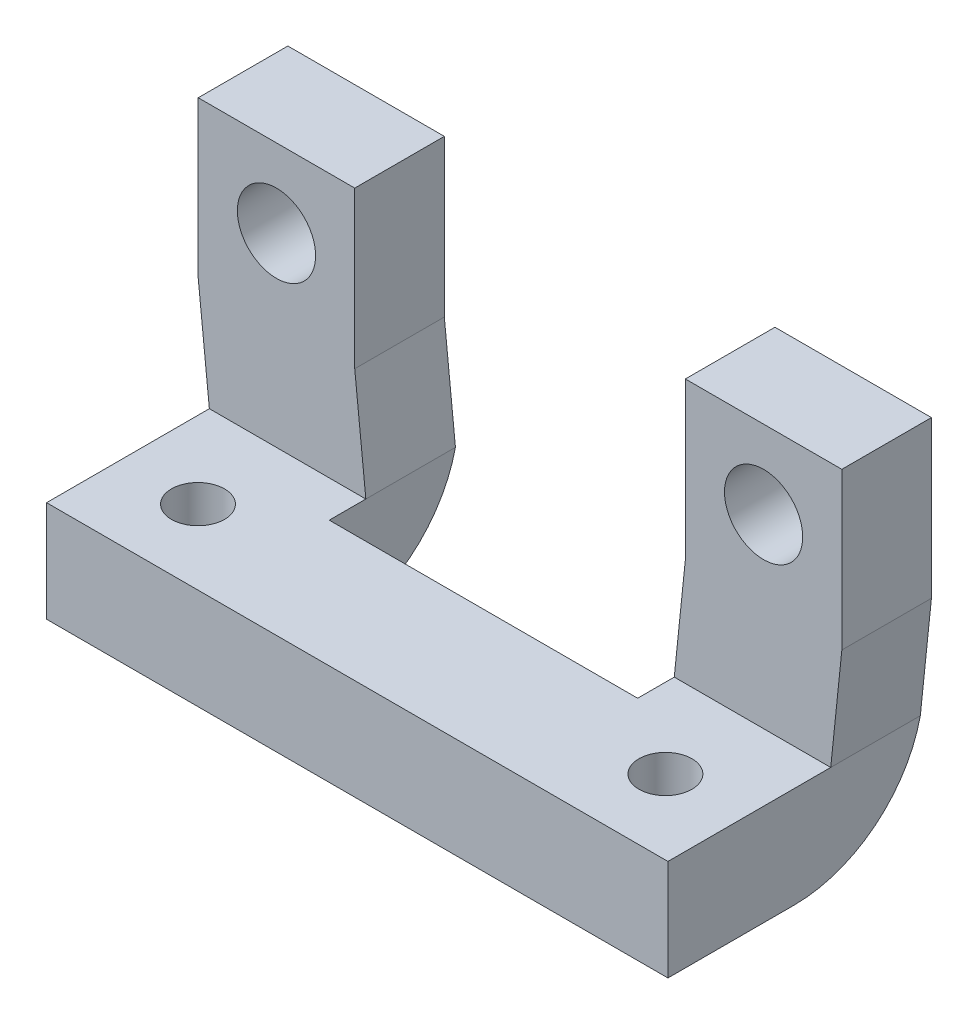
ISO-10303-21;
HEADER;
FILE_DESCRIPTION(('STEP AP214'),'2;1');
FILE_NAME('part.step','',(''),(''),'','','');
FILE_SCHEMA(('AUTOMOTIVE_DESIGN { 1 0 10303 214 1 1 1 1 }'));
ENDSEC;
DATA;
#1=APPLICATION_CONTEXT('core data for automotive mechanical design processes');
#2=APPLICATION_PROTOCOL_DEFINITION('international standard','automotive_design',2000,#1);
#3=PRODUCT_CONTEXT('',#1,'mechanical');
#4=PRODUCT('Part','Part','',(#3));
#5=PRODUCT_RELATED_PRODUCT_CATEGORY('part','',(#4));
#6=PRODUCT_DEFINITION_FORMATION('','',#4);
#7=PRODUCT_DEFINITION_CONTEXT('part definition',#1,'design');
#8=PRODUCT_DEFINITION('design','',#6,#7);
#9=PRODUCT_DEFINITION_SHAPE('','',#8);
#10=(LENGTH_UNIT() NAMED_UNIT(*) SI_UNIT(.MILLI.,.METRE.));
#11=(NAMED_UNIT(*) PLANE_ANGLE_UNIT() SI_UNIT($,.RADIAN.));
#12=(NAMED_UNIT(*) SI_UNIT($,.STERADIAN.) SOLID_ANGLE_UNIT());
#13=UNCERTAINTY_MEASURE_WITH_UNIT(LENGTH_MEASURE(1.E-05),#10,'distance_accuracy_value','');
#14=(GEOMETRIC_REPRESENTATION_CONTEXT(3) GLOBAL_UNCERTAINTY_ASSIGNED_CONTEXT((#13)) GLOBAL_UNIT_ASSIGNED_CONTEXT((#10,
#11,#12)) REPRESENTATION_CONTEXT('',''));
#15=CARTESIAN_POINT('',(0.,0.,0.));
#16=DIRECTION('',(0.,0.,1.));
#17=DIRECTION('',(1.,0.,0.));
#18=AXIS2_PLACEMENT_3D('',#15,#16,#17);
#19=CARTESIAN_POINT('',(0.,0.,-10.));
#20=DIRECTION('',(0.,0.,1.));
#21=DIRECTION('',(1.,0.,0.));
#22=AXIS2_PLACEMENT_3D('',#19,#20,#21);
#23=PLANE('',#22);
#24=DIRECTION('',(-1.,0.,0.));
#25=VECTOR('',#24,1.);
#26=CARTESIAN_POINT('',(-6.11,4.,-10.));
#27=LINE('',#26,#25);
#28=CARTESIAN_POINT('',(-6.11,4.,-10.));
#29=VERTEX_POINT('',#28);
#30=CARTESIAN_POINT('',(-12.31,4.,-10.));
#31=VERTEX_POINT('',#30);
#32=EDGE_CURVE('E293',#29,#31,#27,.T.);
#33=ORIENTED_EDGE('',*,*,#32,.T.);
#34=DIRECTION('',(-0.102979000781295,0.994683530273868,0.));
#35=VECTOR('',#34,1.);
#36=CARTESIAN_POINT('',(-12.75,8.25,-10.));
#37=LINE('',#36,#35);
#38=CARTESIAN_POINT('',(-12.75,8.25,-10.));
#39=VERTEX_POINT('',#38);
#40=EDGE_CURVE('E296',#31,#39,#37,.T.);
#41=ORIENTED_EDGE('',*,*,#40,.T.);
#42=DIRECTION('',(0.,1.,0.));
#43=VECTOR('',#42,1.);
#44=CARTESIAN_POINT('',(-12.75,14.45,-10.));
#45=LINE('',#44,#43);
#46=CARTESIAN_POINT('',(-12.75,14.45,-10.));
#47=VERTEX_POINT('',#46);
#48=EDGE_CURVE('E299',#39,#47,#45,.T.);
#49=ORIENTED_EDGE('',*,*,#48,.T.);
#50=DIRECTION('',(1.,0.,0.));
#51=VECTOR('',#50,1.);
#52=CARTESIAN_POINT('',(-6.55,14.45,-10.));
#53=LINE('',#52,#51);
#54=CARTESIAN_POINT('',(-6.55,14.45,-10.));
#55=VERTEX_POINT('',#54);
#56=EDGE_CURVE('E302',#47,#55,#53,.T.);
#57=ORIENTED_EDGE('',*,*,#56,.T.);
#58=DIRECTION('',(0.,-1.,0.));
#59=VECTOR('',#58,1.);
#60=CARTESIAN_POINT('',(-6.55,8.25,-10.));
#61=LINE('',#60,#59);
#62=CARTESIAN_POINT('',(-6.55,8.25,-10.));
#63=VERTEX_POINT('',#62);
#64=EDGE_CURVE('E61',#55,#63,#61,.T.);
#65=ORIENTED_EDGE('',*,*,#64,.T.);
#66=DIRECTION('',(0.102979000781295,-0.994683530273868,0.));
#67=VECTOR('',#66,1.);
#68=CARTESIAN_POINT('',(-6.11,4.,-10.));
#69=LINE('',#68,#67);
#70=EDGE_CURVE('E56',#63,#29,#69,.T.);
#71=ORIENTED_EDGE('',*,*,#70,.T.);
#72=EDGE_LOOP('',(#33,#41,#49,#57,#65,#71));
#73=FACE_BOUND('',#72,.T.);
#74=CARTESIAN_POINT('',(-9.65,11.35,-10.));
#75=DIRECTION('',(0.,0.,-1.));
#76=DIRECTION('',(-1.,0.,0.));
#77=AXIS2_PLACEMENT_3D('',#74,#75,#76);
#78=CIRCLE('',#77,1.55);
#79=CARTESIAN_POINT('',(-11.2,11.35,-10.));
#80=VERTEX_POINT('',#79);
#81=EDGE_CURVE('E289',#80,#80,#78,.T.);
#82=ORIENTED_EDGE('',*,*,#81,.F.);
#83=EDGE_LOOP('',(#82));
#84=FACE_BOUND('',#83,.T.);
#85=ADVANCED_FACE('F39',(#73,#84),#23,.F.);
#86=CARTESIAN_POINT('',(-12.75,8.25,-10.));
#87=DIRECTION('',(0.994683530273869,0.102979000781295,0.));
#88=DIRECTION('',(-0.102979000781295,0.994683530273869,0.));
#89=AXIS2_PLACEMENT_3D('',#86,#87,#88);
#90=PLANE('',#89);
#91=DIRECTION('',(0.,0.,1.));
#92=VECTOR('',#91,1.);
#93=CARTESIAN_POINT('',(-12.31,4.,-10.));
#94=LINE('',#93,#92);
#95=CARTESIAN_POINT('',(-12.31,4.,-6.44999999999999));
#96=VERTEX_POINT('',#95);
#97=EDGE_CURVE('E11',#31,#96,#94,.T.);
#98=ORIENTED_EDGE('',*,*,#97,.T.);
#99=DIRECTION('',(-0.102979000781295,0.994683530273869,0.));
#100=VECTOR('',#99,1.);
#101=CARTESIAN_POINT('',(-12.75,8.25,-6.44999999999999));
#102=LINE('',#101,#100);
#103=CARTESIAN_POINT('',(-12.75,8.25,-6.44999999999999));
#104=VERTEX_POINT('',#103);
#105=EDGE_CURVE('E337',#96,#104,#102,.T.);
#106=ORIENTED_EDGE('',*,*,#105,.T.);
#107=DIRECTION('',(0.,0.,1.));
#108=VECTOR('',#107,1.);
#109=CARTESIAN_POINT('',(-12.75,8.25,-10.));
#110=LINE('',#109,#108);
#111=EDGE_CURVE('E49',#39,#104,#110,.T.);
#112=ORIENTED_EDGE('',*,*,#111,.F.);
#113=ORIENTED_EDGE('',*,*,#40,.F.);
#114=EDGE_LOOP('',(#98,#106,#112,#113));
#115=FACE_BOUND('',#114,.T.);
#116=ADVANCED_FACE('F41',(#115),#90,.F.);
#117=CARTESIAN_POINT('',(-12.75,14.45,-10.));
#118=DIRECTION('',(1.,0.,0.));
#119=DIRECTION('',(0.,0.,-1.));
#120=AXIS2_PLACEMENT_3D('',#117,#118,#119);
#121=PLANE('',#120);
#122=ORIENTED_EDGE('',*,*,#111,.T.);
#123=DIRECTION('',(0.,-1.,0.));
#124=VECTOR('',#123,1.);
#125=CARTESIAN_POINT('',(-12.75,4.,-6.44999999999999));
#126=LINE('',#125,#124);
#127=CARTESIAN_POINT('',(-12.75,14.45,-6.45));
#128=VERTEX_POINT('',#127);
#129=EDGE_CURVE('E333',#128,#104,#126,.T.);
#130=ORIENTED_EDGE('',*,*,#129,.F.);
#131=DIRECTION('',(0.,0.,1.));
#132=VECTOR('',#131,1.);
#133=CARTESIAN_POINT('',(-12.75,14.45,-10.));
#134=LINE('',#133,#132);
#135=EDGE_CURVE('E321',#47,#128,#134,.T.);
#136=ORIENTED_EDGE('',*,*,#135,.F.);
#137=ORIENTED_EDGE('',*,*,#48,.F.);
#138=EDGE_LOOP('',(#122,#130,#136,#137));
#139=FACE_BOUND('',#138,.T.);
#140=ADVANCED_FACE('F331',(#139),#121,.F.);
#141=CARTESIAN_POINT('',(-6.55,14.45,-10.));
#142=DIRECTION('',(0.,-1.,0.));
#143=DIRECTION('',(0.,0.,-1.));
#144=AXIS2_PLACEMENT_3D('',#141,#142,#143);
#145=PLANE('',#144);
#146=ORIENTED_EDGE('',*,*,#135,.T.);
#147=DIRECTION('',(1.,0.,0.));
#148=VECTOR('',#147,1.);
#149=CARTESIAN_POINT('',(-23.300118482747,14.45,-6.44999999999999));
#150=LINE('',#149,#148);
#151=CARTESIAN_POINT('',(-6.55,14.45,-6.44999999999999));
#152=VERTEX_POINT('',#151);
#153=EDGE_CURVE('E183',#128,#152,#150,.T.);
#154=ORIENTED_EDGE('',*,*,#153,.T.);
#155=DIRECTION('',(0.,0.,1.));
#156=VECTOR('',#155,1.);
#157=CARTESIAN_POINT('',(-6.55,14.45,-10.));
#158=LINE('',#157,#156);
#159=EDGE_CURVE('E317',#55,#152,#158,.T.);
#160=ORIENTED_EDGE('',*,*,#159,.F.);
#161=ORIENTED_EDGE('',*,*,#56,.F.);
#162=EDGE_LOOP('',(#146,#154,#160,#161));
#163=FACE_BOUND('',#162,.T.);
#164=ADVANCED_FACE('F430',(#163),#145,.F.);
#165=CARTESIAN_POINT('',(-6.55,8.25,-10.));
#166=DIRECTION('',(-1.,0.,0.));
#167=DIRECTION('',(0.,0.,1.));
#168=AXIS2_PLACEMENT_3D('',#165,#166,#167);
#169=PLANE('',#168);
#170=ORIENTED_EDGE('',*,*,#159,.T.);
#171=DIRECTION('',(0.,-1.,0.));
#172=VECTOR('',#171,1.);
#173=CARTESIAN_POINT('',(-6.55,8.25,-6.44999999999999));
#174=LINE('',#173,#172);
#175=CARTESIAN_POINT('',(-6.55,8.25,-6.44999999999999));
#176=VERTEX_POINT('',#175);
#177=EDGE_CURVE('E344',#152,#176,#174,.T.);
#178=ORIENTED_EDGE('',*,*,#177,.T.);
#179=DIRECTION('',(0.,0.,1.));
#180=VECTOR('',#179,1.);
#181=CARTESIAN_POINT('',(-6.55,8.25,-10.));
#182=LINE('',#181,#180);
#183=EDGE_CURVE('E313',#63,#176,#182,.T.);
#184=ORIENTED_EDGE('',*,*,#183,.F.);
#185=ORIENTED_EDGE('',*,*,#64,.F.);
#186=EDGE_LOOP('',(#170,#178,#184,#185));
#187=FACE_BOUND('',#186,.T.);
#188=ADVANCED_FACE('F432',(#187),#169,.F.);
#189=CARTESIAN_POINT('',(-6.11,4.,-10.));
#190=DIRECTION('',(-0.994683530273869,-0.102979000781295,0.));
#191=DIRECTION('',(0.102979000781295,-0.994683530273869,0.));
#192=AXIS2_PLACEMENT_3D('',#189,#190,#191);
#193=PLANE('',#192);
#194=ORIENTED_EDGE('',*,*,#183,.T.);
#195=DIRECTION('',(0.102979000781295,-0.994683530273869,0.));
#196=VECTOR('',#195,1.);
#197=CARTESIAN_POINT('',(-6.11,4.,-6.44999999999999));
#198=LINE('',#197,#196);
#199=CARTESIAN_POINT('',(-6.11,4.,-6.44999999999999));
#200=VERTEX_POINT('',#199);
#201=EDGE_CURVE('E352',#176,#200,#198,.T.);
#202=ORIENTED_EDGE('',*,*,#201,.T.);
#203=DIRECTION('',(0.,0.,1.));
#204=VECTOR('',#203,1.);
#205=CARTESIAN_POINT('',(-6.11,4.,-10.));
#206=LINE('',#205,#204);
#207=EDGE_CURVE('E309',#29,#200,#206,.T.);
#208=ORIENTED_EDGE('',*,*,#207,.F.);
#209=ORIENTED_EDGE('',*,*,#70,.F.);
#210=EDGE_LOOP('',(#194,#202,#208,#209));
#211=FACE_BOUND('',#210,.T.);
#212=ADVANCED_FACE('F416',(#211),#193,.F.);
#213=CARTESIAN_POINT('',(-9.65,11.35,-10.));
#214=DIRECTION('',(0.,0.,1.));
#215=DIRECTION('',(1.,0.,0.));
#216=AXIS2_PLACEMENT_3D('',#213,#214,#215);
#217=CYLINDRICAL_SURFACE('',#216,1.55);
#218=CARTESIAN_POINT('',(-9.65,11.35,-6.44999999999999));
#219=DIRECTION('',(0.,0.,-1.));
#220=DIRECTION('',(-1.,0.,0.));
#221=AXIS2_PLACEMENT_3D('',#218,#219,#220);
#222=CIRCLE('',#221,1.55);
#223=CARTESIAN_POINT('',(-11.2,11.35,-6.44999999999999));
#224=VERTEX_POINT('',#223);
#225=EDGE_CURVE('E407',#224,#224,#222,.T.);
#226=ORIENTED_EDGE('',*,*,#225,.F.);
#227=EDGE_LOOP('',(#226));
#228=FACE_BOUND('',#227,.T.);
#229=ORIENTED_EDGE('',*,*,#81,.T.);
#230=EDGE_LOOP('',(#229));
#231=FACE_BOUND('',#230,.T.);
#232=ADVANCED_FACE('F483',(#228,#231),#217,.F.);
#233=CARTESIAN_POINT('',(-6.11,5.125,-5.));
#234=DIRECTION('',(-1.,0.,0.));
#235=DIRECTION('',(0.,0.,1.));
#236=AXIS2_PLACEMENT_3D('',#233,#234,#235);
#237=CYLINDRICAL_SURFACE('',#236,5.125);
#238=CARTESIAN_POINT('',(-12.31,5.125,-5.));
#239=DIRECTION('',(-1.,0.,0.));
#240=DIRECTION('',(0.,0.,1.));
#241=AXIS2_PLACEMENT_3D('',#238,#239,#240);
#242=CIRCLE('',#241,5.125);
#243=CARTESIAN_POINT('',(-12.31,0.,-5.));
#244=VERTEX_POINT('',#243);
#245=EDGE_CURVE('E273',#31,#244,#242,.T.);
#246=ORIENTED_EDGE('',*,*,#245,.F.);
#247=ORIENTED_EDGE('',*,*,#32,.F.);
#248=CARTESIAN_POINT('',(-6.11,5.125,-5.));
#249=DIRECTION('',(-1.,0.,0.));
#250=DIRECTION('',(0.,0.,1.));
#251=AXIS2_PLACEMENT_3D('',#248,#249,#250);
#252=CIRCLE('',#251,5.125);
#253=CARTESIAN_POINT('',(-6.10999999999999,0.,-5.));
#254=VERTEX_POINT('',#253);
#255=EDGE_CURVE('E274',#29,#254,#252,.T.);
#256=ORIENTED_EDGE('',*,*,#255,.T.);
#257=DIRECTION('',(-1.,0.,0.));
#258=VECTOR('',#257,1.);
#259=CARTESIAN_POINT('',(-6.11,0.,-5.));
#260=LINE('',#259,#258);
#261=EDGE_CURVE('E282',#254,#244,#260,.T.);
#262=ORIENTED_EDGE('',*,*,#261,.T.);
#263=EDGE_LOOP('',(#246,#247,#256,#262));
#264=FACE_BOUND('',#263,.T.);
#265=ADVANCED_FACE('F424',(#264),#237,.T.);
#266=CARTESIAN_POINT('',(-6.11,5.125,-5.));
#267=DIRECTION('',(-1.,0.,0.));
#268=DIRECTION('',(0.,0.,1.));
#269=AXIS2_PLACEMENT_3D('',#266,#267,#268);
#270=PLANE('',#269);
#271=ORIENTED_EDGE('',*,*,#207,.T.);
#272=DIRECTION('',(0.,0.,1.));
#273=VECTOR('',#272,1.);
#274=CARTESIAN_POINT('',(-6.11,4.,-5.));
#275=LINE('',#274,#273);
#276=CARTESIAN_POINT('',(-6.10999999999999,4.,-5.));
#277=VERTEX_POINT('',#276);
#278=EDGE_CURVE('E349',#200,#277,#275,.T.);
#279=ORIENTED_EDGE('',*,*,#278,.T.);
#280=DIRECTION('',(0.,1.,0.));
#281=VECTOR('',#280,1.);
#282=CARTESIAN_POINT('',(-6.11,4.,-5.));
#283=LINE('',#282,#281);
#284=EDGE_CURVE('E278',#254,#277,#283,.T.);
#285=ORIENTED_EDGE('',*,*,#284,.F.);
#286=ORIENTED_EDGE('',*,*,#255,.F.);
#287=EDGE_LOOP('',(#271,#279,#285,#286));
#288=FACE_BOUND('',#287,.T.);
#289=ADVANCED_FACE('F420',(#288),#270,.F.);
#290=CARTESIAN_POINT('',(-12.31,5.125,-5.));
#291=DIRECTION('',(-1.,0.,0.));
#292=DIRECTION('',(0.,0.,1.));
#293=AXIS2_PLACEMENT_3D('',#290,#291,#292);
#294=PLANE('',#293);
#295=ORIENTED_EDGE('',*,*,#97,.F.);
#296=ORIENTED_EDGE('',*,*,#245,.T.);
#297=DIRECTION('',(0.,0.,1.));
#298=VECTOR('',#297,1.);
#299=CARTESIAN_POINT('',(-12.31,0.,-5.));
#300=LINE('',#299,#298);
#301=CARTESIAN_POINT('',(-12.31,0.,0.));
#302=VERTEX_POINT('',#301);
#303=EDGE_CURVE('E257',#244,#302,#300,.T.);
#304=ORIENTED_EDGE('',*,*,#303,.T.);
#305=DIRECTION('',(0.,-1.,0.));
#306=VECTOR('',#305,1.);
#307=CARTESIAN_POINT('',(-12.31,4.,0.));
#308=LINE('',#307,#306);
#309=CARTESIAN_POINT('',(-12.31,4.,0.));
#310=VERTEX_POINT('',#309);
#311=EDGE_CURVE('E269',#310,#302,#308,.T.);
#312=ORIENTED_EDGE('',*,*,#311,.F.);
#313=DIRECTION('',(0.,0.,1.));
#314=VECTOR('',#313,1.);
#315=CARTESIAN_POINT('',(-12.31,4.,-5.));
#316=LINE('',#315,#314);
#317=EDGE_CURVE('E242',#96,#310,#316,.T.);
#318=ORIENTED_EDGE('',*,*,#317,.F.);
#319=EDGE_LOOP('',(#295,#296,#304,#312,#318));
#320=FACE_BOUND('',#319,.T.);
#321=ADVANCED_FACE('F461',(#320),#294,.T.);
#322=CARTESIAN_POINT('',(12.31,4.,-5.));
#323=DIRECTION('',(0.,0.,1.));
#324=DIRECTION('',(1.,0.,0.));
#325=AXIS2_PLACEMENT_3D('',#322,#323,#324);
#326=PLANE('',#325);
#327=DIRECTION('',(-1.,0.,0.));
#328=VECTOR('',#327,1.);
#329=CARTESIAN_POINT('',(12.31,0.,-5.));
#330=LINE('',#329,#328);
#331=CARTESIAN_POINT('',(6.11,0.,-5.));
#332=VERTEX_POINT('',#331);
#333=EDGE_CURVE('E234',#332,#254,#330,.T.);
#334=ORIENTED_EDGE('',*,*,#333,.T.);
#335=ORIENTED_EDGE('',*,*,#284,.T.);
#336=DIRECTION('',(-1.,0.,0.));
#337=VECTOR('',#336,1.);
#338=CARTESIAN_POINT('',(12.31,4.,-5.));
#339=LINE('',#338,#337);
#340=CARTESIAN_POINT('',(6.11,4.,-5.));
#341=VERTEX_POINT('',#340);
#342=EDGE_CURVE('E238',#341,#277,#339,.T.);
#343=ORIENTED_EDGE('',*,*,#342,.F.);
#344=DIRECTION('',(0.,-1.,0.));
#345=VECTOR('',#344,1.);
#346=CARTESIAN_POINT('',(6.11,0.,-5.));
#347=LINE('',#346,#345);
#348=EDGE_CURVE('E210',#341,#332,#347,.T.);
#349=ORIENTED_EDGE('',*,*,#348,.T.);
#350=EDGE_LOOP('',(#334,#335,#343,#349));
#351=FACE_BOUND('',#350,.T.);
#352=ADVANCED_FACE('F451',(#351),#326,.F.);
#353=CARTESIAN_POINT('',(0.,4.,0.));
#354=DIRECTION('',(0.,1.,0.));
#355=DIRECTION('',(0.,0.,1.));
#356=AXIS2_PLACEMENT_3D('',#353,#354,#355);
#357=PLANE('',#356);
#358=CARTESIAN_POINT('',(-9.26,4.,-2.95));
#359=DIRECTION('',(0.,1.,0.));
#360=DIRECTION('',(0.,0.,1.));
#361=AXIS2_PLACEMENT_3D('',#358,#359,#360);
#362=CIRCLE('',#361,1.05);
#363=CARTESIAN_POINT('',(-9.26,4.,-1.9));
#364=VERTEX_POINT('',#363);
#365=EDGE_CURVE('E230',#364,#364,#362,.T.);
#366=ORIENTED_EDGE('',*,*,#365,.F.);
#367=EDGE_LOOP('',(#366));
#368=FACE_BOUND('',#367,.T.);
#369=CARTESIAN_POINT('',(9.26,4.,-2.95));
#370=DIRECTION('',(0.,1.,0.));
#371=DIRECTION('',(0.,0.,1.));
#372=AXIS2_PLACEMENT_3D('',#369,#370,#371);
#373=CIRCLE('',#372,1.05);
#374=CARTESIAN_POINT('',(9.26,4.,-1.9));
#375=VERTEX_POINT('',#374);
#376=EDGE_CURVE('E222',#375,#375,#373,.T.);
#377=ORIENTED_EDGE('',*,*,#376,.F.);
#378=EDGE_LOOP('',(#377));
#379=FACE_BOUND('',#378,.T.);
#380=DIRECTION('',(0.,0.,-1.));
#381=VECTOR('',#380,1.);
#382=CARTESIAN_POINT('',(12.31,4.,0.));
#383=LINE('',#382,#381);
#384=CARTESIAN_POINT('',(12.31,4.,0.));
#385=VERTEX_POINT('',#384);
#386=CARTESIAN_POINT('',(12.31,4.,-6.45));
#387=VERTEX_POINT('',#386);
#388=EDGE_CURVE('E249',#385,#387,#383,.T.);
#389=ORIENTED_EDGE('',*,*,#388,.T.);
#390=DIRECTION('',(1.,0.,0.));
#391=VECTOR('',#390,1.);
#392=CARTESIAN_POINT('',(-23.300118482747,4.,-6.44999999999999));
#393=LINE('',#392,#391);
#394=CARTESIAN_POINT('',(6.11,4.,-6.45));
#395=VERTEX_POINT('',#394);
#396=EDGE_CURVE('E435',#395,#387,#393,.T.);
#397=ORIENTED_EDGE('',*,*,#396,.F.);
#398=DIRECTION('',(0.,0.,-1.));
#399=VECTOR('',#398,1.);
#400=CARTESIAN_POINT('',(6.11,4.,-10.));
#401=LINE('',#400,#399);
#402=EDGE_CURVE('E343',#341,#395,#401,.T.);
#403=ORIENTED_EDGE('',*,*,#402,.F.);
#404=ORIENTED_EDGE('',*,*,#342,.T.);
#405=ORIENTED_EDGE('',*,*,#278,.F.);
#406=EDGE_CURVE('E437',#96,#200,#393,.T.);
#407=ORIENTED_EDGE('',*,*,#406,.F.);
#408=ORIENTED_EDGE('',*,*,#317,.T.);
#409=DIRECTION('',(1.,0.,0.));
#410=VECTOR('',#409,1.);
#411=CARTESIAN_POINT('',(-12.31,4.,0.));
#412=LINE('',#411,#410);
#413=EDGE_CURVE('E246',#310,#385,#412,.T.);
#414=ORIENTED_EDGE('',*,*,#413,.T.);
#415=EDGE_LOOP('',(#389,#397,#403,#404,#405,#407,#408,#414));
#416=FACE_BOUND('',#415,.T.);
#417=ADVANCED_FACE('F445',(#368,#379,#416),#357,.T.);
#418=CARTESIAN_POINT('',(0.,0.,0.));
#419=DIRECTION('',(0.,1.,0.));
#420=DIRECTION('',(0.,0.,1.));
#421=AXIS2_PLACEMENT_3D('',#418,#419,#420);
#422=PLANE('',#421);
#423=CARTESIAN_POINT('',(12.31,0.,-5.));
#424=VERTEX_POINT('',#423);
#425=EDGE_CURVE('E253',#424,#332,#330,.T.);
#426=ORIENTED_EDGE('',*,*,#425,.F.);
#427=DIRECTION('',(0.,0.,-1.));
#428=VECTOR('',#427,1.);
#429=CARTESIAN_POINT('',(12.31,0.,0.));
#430=LINE('',#429,#428);
#431=CARTESIAN_POINT('',(12.31,0.,0.));
#432=VERTEX_POINT('',#431);
#433=EDGE_CURVE('E243',#432,#424,#430,.T.);
#434=ORIENTED_EDGE('',*,*,#433,.F.);
#435=DIRECTION('',(1.,0.,0.));
#436=VECTOR('',#435,1.);
#437=CARTESIAN_POINT('',(-12.31,0.,0.));
#438=LINE('',#437,#436);
#439=EDGE_CURVE('E260',#302,#432,#438,.T.);
#440=ORIENTED_EDGE('',*,*,#439,.F.);
#441=ORIENTED_EDGE('',*,*,#303,.F.);
#442=ORIENTED_EDGE('',*,*,#261,.F.);
#443=ORIENTED_EDGE('',*,*,#333,.F.);
#444=EDGE_LOOP('',(#426,#434,#440,#441,#442,#443));
#445=FACE_BOUND('',#444,.T.);
#446=CARTESIAN_POINT('',(-9.26,0.,-2.95));
#447=DIRECTION('',(0.,1.,0.));
#448=DIRECTION('',(0.,0.,1.));
#449=AXIS2_PLACEMENT_3D('',#446,#447,#448);
#450=CIRCLE('',#449,1.05);
#451=CARTESIAN_POINT('',(-9.26,0.,-1.9));
#452=VERTEX_POINT('',#451);
#453=EDGE_CURVE('E226',#452,#452,#450,.T.);
#454=ORIENTED_EDGE('',*,*,#453,.T.);
#455=EDGE_LOOP('',(#454));
#456=FACE_BOUND('',#455,.T.);
#457=CARTESIAN_POINT('',(9.26,0.,-2.95));
#458=DIRECTION('',(0.,1.,0.));
#459=DIRECTION('',(0.,0.,1.));
#460=AXIS2_PLACEMENT_3D('',#457,#458,#459);
#461=CIRCLE('',#460,1.05);
#462=CARTESIAN_POINT('',(9.26,0.,-1.9));
#463=VERTEX_POINT('',#462);
#464=EDGE_CURVE('E221',#463,#463,#461,.T.);
#465=ORIENTED_EDGE('',*,*,#464,.T.);
#466=EDGE_LOOP('',(#465));
#467=FACE_BOUND('',#466,.T.);
#468=ADVANCED_FACE('F456',(#445,#456,#467),#422,.F.);
#469=CARTESIAN_POINT('',(-12.31,4.,0.));
#470=DIRECTION('',(0.,0.,-1.));
#471=DIRECTION('',(-1.,0.,0.));
#472=AXIS2_PLACEMENT_3D('',#469,#470,#471);
#473=PLANE('',#472);
#474=ORIENTED_EDGE('',*,*,#439,.T.);
#475=DIRECTION('',(0.,-1.,0.));
#476=VECTOR('',#475,1.);
#477=CARTESIAN_POINT('',(12.31,4.,0.));
#478=LINE('',#477,#476);
#479=EDGE_CURVE('E252',#385,#432,#478,.T.);
#480=ORIENTED_EDGE('',*,*,#479,.F.);
#481=ORIENTED_EDGE('',*,*,#413,.F.);
#482=ORIENTED_EDGE('',*,*,#311,.T.);
#483=EDGE_LOOP('',(#474,#480,#481,#482));
#484=FACE_BOUND('',#483,.T.);
#485=ADVANCED_FACE('F464',(#484),#473,.F.);
#486=CARTESIAN_POINT('',(12.31,4.,0.));
#487=DIRECTION('',(-1.,0.,0.));
#488=DIRECTION('',(0.,0.,1.));
#489=AXIS2_PLACEMENT_3D('',#486,#487,#488);
#490=PLANE('',#489);
#491=ORIENTED_EDGE('',*,*,#433,.T.);
#492=CARTESIAN_POINT('',(12.31,5.125,-5.));
#493=DIRECTION('',(1.,0.,0.));
#494=DIRECTION('',(0.,0.,-1.));
#495=AXIS2_PLACEMENT_3D('',#492,#493,#494);
#496=CIRCLE('',#495,5.125);
#497=CARTESIAN_POINT('',(12.31,4.,-10.));
#498=VERTEX_POINT('',#497);
#499=EDGE_CURVE('E201',#424,#498,#496,.T.);
#500=ORIENTED_EDGE('',*,*,#499,.T.);
#501=DIRECTION('',(0.,0.,1.));
#502=VECTOR('',#501,1.);
#503=CARTESIAN_POINT('',(12.31,4.,-10.));
#504=LINE('',#503,#502);
#505=EDGE_CURVE('E194',#498,#387,#504,.T.);
#506=ORIENTED_EDGE('',*,*,#505,.T.);
#507=ORIENTED_EDGE('',*,*,#388,.F.);
#508=ORIENTED_EDGE('',*,*,#479,.T.);
#509=EDGE_LOOP('',(#491,#500,#506,#507,#508));
#510=FACE_BOUND('',#509,.T.);
#511=ADVANCED_FACE('F380',(#510),#490,.F.);
#512=CARTESIAN_POINT('',(-9.26,4.,-2.95));
#513=DIRECTION('',(0.,-1.,0.));
#514=DIRECTION('',(0.,0.,-1.));
#515=AXIS2_PLACEMENT_3D('',#512,#513,#514);
#516=CYLINDRICAL_SURFACE('',#515,1.05);
#517=ORIENTED_EDGE('',*,*,#365,.T.);
#518=EDGE_LOOP('',(#517));
#519=FACE_BOUND('',#518,.T.);
#520=ORIENTED_EDGE('',*,*,#453,.F.);
#521=EDGE_LOOP('',(#520));
#522=FACE_BOUND('',#521,.T.);
#523=ADVANCED_FACE('F472',(#519,#522),#516,.F.);
#524=CARTESIAN_POINT('',(9.26,4.,-2.95));
#525=DIRECTION('',(0.,-1.,0.));
#526=DIRECTION('',(0.,0.,-1.));
#527=AXIS2_PLACEMENT_3D('',#524,#525,#526);
#528=CYLINDRICAL_SURFACE('',#527,1.05);
#529=ORIENTED_EDGE('',*,*,#376,.T.);
#530=EDGE_LOOP('',(#529));
#531=FACE_BOUND('',#530,.T.);
#532=ORIENTED_EDGE('',*,*,#464,.F.);
#533=EDGE_LOOP('',(#532));
#534=FACE_BOUND('',#533,.T.);
#535=ADVANCED_FACE('F562',(#531,#534),#528,.F.);
#536=CARTESIAN_POINT('',(6.11,5.125,-5.));
#537=DIRECTION('',(1.,0.,0.));
#538=DIRECTION('',(0.,0.,-1.));
#539=AXIS2_PLACEMENT_3D('',#536,#537,#538);
#540=CYLINDRICAL_SURFACE('',#539,5.125);
#541=ORIENTED_EDGE('',*,*,#499,.F.);
#542=ORIENTED_EDGE('',*,*,#425,.T.);
#543=CARTESIAN_POINT('',(6.11,5.125,-5.));
#544=DIRECTION('',(1.,0.,0.));
#545=DIRECTION('',(0.,0.,-1.));
#546=AXIS2_PLACEMENT_3D('',#543,#544,#545);
#547=CIRCLE('',#546,5.125);
#548=CARTESIAN_POINT('',(6.11,4.,-10.));
#549=VERTEX_POINT('',#548);
#550=EDGE_CURVE('E202',#332,#549,#547,.T.);
#551=ORIENTED_EDGE('',*,*,#550,.T.);
#552=DIRECTION('',(1.,0.,0.));
#553=VECTOR('',#552,1.);
#554=CARTESIAN_POINT('',(6.11,4.,-10.));
#555=LINE('',#554,#553);
#556=EDGE_CURVE('E214',#549,#498,#555,.T.);
#557=ORIENTED_EDGE('',*,*,#556,.T.);
#558=EDGE_LOOP('',(#541,#542,#551,#557));
#559=FACE_BOUND('',#558,.T.);
#560=ADVANCED_FACE('F386',(#559),#540,.T.);
#561=CARTESIAN_POINT('',(6.11,5.125,-5.));
#562=DIRECTION('',(1.,0.,0.));
#563=DIRECTION('',(0.,0.,-1.));
#564=AXIS2_PLACEMENT_3D('',#561,#562,#563);
#565=PLANE('',#564);
#566=ORIENTED_EDGE('',*,*,#550,.F.);
#567=ORIENTED_EDGE('',*,*,#348,.F.);
#568=ORIENTED_EDGE('',*,*,#402,.T.);
#569=DIRECTION('',(0.,0.,1.));
#570=VECTOR('',#569,1.);
#571=CARTESIAN_POINT('',(6.11,4.,-5.));
#572=LINE('',#571,#570);
#573=EDGE_CURVE('E206',#549,#395,#572,.T.);
#574=ORIENTED_EDGE('',*,*,#573,.F.);
#575=EDGE_LOOP('',(#566,#567,#568,#574));
#576=FACE_BOUND('',#575,.T.);
#577=ADVANCED_FACE('F393',(#576),#565,.F.);
#578=CARTESIAN_POINT('',(0.,0.,-10.));
#579=DIRECTION('',(0.,0.,1.));
#580=DIRECTION('',(1.,0.,0.));
#581=AXIS2_PLACEMENT_3D('',#578,#579,#580);
#582=PLANE('',#581);
#583=ORIENTED_EDGE('',*,*,#556,.F.);
#584=DIRECTION('',(0.102979000781295,0.994683530273868,0.));
#585=VECTOR('',#584,1.);
#586=CARTESIAN_POINT('',(6.55,8.25,-10.));
#587=LINE('',#586,#585);
#588=CARTESIAN_POINT('',(6.55,8.25,-10.));
#589=VERTEX_POINT('',#588);
#590=EDGE_CURVE('E362',#549,#589,#587,.T.);
#591=ORIENTED_EDGE('',*,*,#590,.T.);
#592=DIRECTION('',(0.,1.,0.));
#593=VECTOR('',#592,1.);
#594=CARTESIAN_POINT('',(6.55,14.45,-10.));
#595=LINE('',#594,#593);
#596=CARTESIAN_POINT('',(6.55,14.45,-10.));
#597=VERTEX_POINT('',#596);
#598=EDGE_CURVE('E365',#589,#597,#595,.T.);
#599=ORIENTED_EDGE('',*,*,#598,.T.);
#600=DIRECTION('',(1.,0.,0.));
#601=VECTOR('',#600,1.);
#602=CARTESIAN_POINT('',(12.75,14.45,-10.));
#603=LINE('',#602,#601);
#604=CARTESIAN_POINT('',(12.75,14.45,-10.));
#605=VERTEX_POINT('',#604);
#606=EDGE_CURVE('E368',#597,#605,#603,.T.);
#607=ORIENTED_EDGE('',*,*,#606,.T.);
#608=DIRECTION('',(0.,-1.,0.));
#609=VECTOR('',#608,1.);
#610=CARTESIAN_POINT('',(12.75,8.25,-10.));
#611=LINE('',#610,#609);
#612=CARTESIAN_POINT('',(12.75,8.25,-10.));
#613=VERTEX_POINT('',#612);
#614=EDGE_CURVE('E186',#605,#613,#611,.T.);
#615=ORIENTED_EDGE('',*,*,#614,.T.);
#616=DIRECTION('',(-0.102979000781295,-0.994683530273868,0.));
#617=VECTOR('',#616,1.);
#618=CARTESIAN_POINT('',(12.31,4.,-10.));
#619=LINE('',#618,#617);
#620=EDGE_CURVE('E373',#613,#498,#619,.T.);
#621=ORIENTED_EDGE('',*,*,#620,.T.);
#622=EDGE_LOOP('',(#583,#591,#599,#607,#615,#621));
#623=FACE_BOUND('',#622,.T.);
#624=CARTESIAN_POINT('',(9.65,11.35,-10.));
#625=DIRECTION('',(0.,0.,-1.));
#626=DIRECTION('',(-1.,0.,0.));
#627=AXIS2_PLACEMENT_3D('',#624,#625,#626);
#628=CIRCLE('',#627,1.55);
#629=CARTESIAN_POINT('',(8.1,11.35,-10.));
#630=VERTEX_POINT('',#629);
#631=EDGE_CURVE('E358',#630,#630,#628,.T.);
#632=ORIENTED_EDGE('',*,*,#631,.F.);
#633=EDGE_LOOP('',(#632));
#634=FACE_BOUND('',#633,.T.);
#635=ADVANCED_FACE('F389',(#623,#634),#582,.F.);
#636=CARTESIAN_POINT('',(6.55,8.25,-10.));
#637=DIRECTION('',(0.994683530273869,-0.102979000781295,0.));
#638=DIRECTION('',(0.102979000781295,0.994683530273869,0.));
#639=AXIS2_PLACEMENT_3D('',#636,#637,#638);
#640=PLANE('',#639);
#641=ORIENTED_EDGE('',*,*,#573,.T.);
#642=DIRECTION('',(0.102979000781295,0.994683530273869,0.));
#643=VECTOR('',#642,1.);
#644=CARTESIAN_POINT('',(6.55,8.25,-6.45));
#645=LINE('',#644,#643);
#646=CARTESIAN_POINT('',(6.55,8.25,-6.45));
#647=VERTEX_POINT('',#646);
#648=EDGE_CURVE('E398',#395,#647,#645,.T.);
#649=ORIENTED_EDGE('',*,*,#648,.T.);
#650=DIRECTION('',(0.,0.,1.));
#651=VECTOR('',#650,1.);
#652=CARTESIAN_POINT('',(6.55,8.25,-10.));
#653=LINE('',#652,#651);
#654=EDGE_CURVE('E192',#589,#647,#653,.T.);
#655=ORIENTED_EDGE('',*,*,#654,.F.);
#656=ORIENTED_EDGE('',*,*,#590,.F.);
#657=EDGE_LOOP('',(#641,#649,#655,#656));
#658=FACE_BOUND('',#657,.T.);
#659=ADVANCED_FACE('F397',(#658),#640,.F.);
#660=CARTESIAN_POINT('',(6.55,14.45,-10.));
#661=DIRECTION('',(1.,0.,0.));
#662=DIRECTION('',(0.,0.,-1.));
#663=AXIS2_PLACEMENT_3D('',#660,#661,#662);
#664=PLANE('',#663);
#665=ORIENTED_EDGE('',*,*,#654,.T.);
#666=DIRECTION('',(0.,1.,0.));
#667=VECTOR('',#666,1.);
#668=CARTESIAN_POINT('',(6.55,14.45,-6.45));
#669=LINE('',#668,#667);
#670=CARTESIAN_POINT('',(6.55,14.45,-6.45));
#671=VERTEX_POINT('',#670);
#672=EDGE_CURVE('E402',#647,#671,#669,.T.);
#673=ORIENTED_EDGE('',*,*,#672,.T.);
#674=DIRECTION('',(0.,0.,1.));
#675=VECTOR('',#674,1.);
#676=CARTESIAN_POINT('',(6.55,14.45,-10.));
#677=LINE('',#676,#675);
#678=EDGE_CURVE('E181',#597,#671,#677,.T.);
#679=ORIENTED_EDGE('',*,*,#678,.F.);
#680=ORIENTED_EDGE('',*,*,#598,.F.);
#681=EDGE_LOOP('',(#665,#673,#679,#680));
#682=FACE_BOUND('',#681,.T.);
#683=ADVANCED_FACE('F401',(#682),#664,.F.);
#684=CARTESIAN_POINT('',(12.75,14.45,-10.));
#685=DIRECTION('',(0.,-1.,0.));
#686=DIRECTION('',(0.,0.,-1.));
#687=AXIS2_PLACEMENT_3D('',#684,#685,#686);
#688=PLANE('',#687);
#689=ORIENTED_EDGE('',*,*,#678,.T.);
#690=CARTESIAN_POINT('',(12.75,14.45,-6.45));
#691=VERTEX_POINT('',#690);
#692=EDGE_CURVE('E163',#671,#691,#150,.T.);
#693=ORIENTED_EDGE('',*,*,#692,.T.);
#694=DIRECTION('',(0.,0.,1.));
#695=VECTOR('',#694,1.);
#696=CARTESIAN_POINT('',(12.75,14.45,-10.));
#697=LINE('',#696,#695);
#698=EDGE_CURVE('E178',#605,#691,#697,.T.);
#699=ORIENTED_EDGE('',*,*,#698,.F.);
#700=ORIENTED_EDGE('',*,*,#606,.F.);
#701=EDGE_LOOP('',(#689,#693,#699,#700));
#702=FACE_BOUND('',#701,.T.);
#703=ADVANCED_FACE('F176',(#702),#688,.F.);
#704=CARTESIAN_POINT('',(12.75,8.25,-10.));
#705=DIRECTION('',(-1.,0.,0.));
#706=DIRECTION('',(0.,0.,1.));
#707=AXIS2_PLACEMENT_3D('',#704,#705,#706);
#708=PLANE('',#707);
#709=ORIENTED_EDGE('',*,*,#698,.T.);
#710=DIRECTION('',(0.,1.,0.));
#711=VECTOR('',#710,1.);
#712=CARTESIAN_POINT('',(12.75,4.,-6.45));
#713=LINE('',#712,#711);
#714=CARTESIAN_POINT('',(12.75,8.25,-6.45));
#715=VERTEX_POINT('',#714);
#716=EDGE_CURVE('E159',#715,#691,#713,.T.);
#717=ORIENTED_EDGE('',*,*,#716,.F.);
#718=DIRECTION('',(0.,0.,1.));
#719=VECTOR('',#718,1.);
#720=CARTESIAN_POINT('',(12.75,8.25,-10.));
#721=LINE('',#720,#719);
#722=EDGE_CURVE('E188',#613,#715,#721,.T.);
#723=ORIENTED_EDGE('',*,*,#722,.F.);
#724=ORIENTED_EDGE('',*,*,#614,.F.);
#725=EDGE_LOOP('',(#709,#717,#723,#724));
#726=FACE_BOUND('',#725,.T.);
#727=ADVANCED_FACE('F185',(#726),#708,.F.);
#728=CARTESIAN_POINT('',(12.31,4.,-10.));
#729=DIRECTION('',(-0.994683530273869,0.102979000781295,0.));
#730=DIRECTION('',(-0.102979000781295,-0.994683530273869,0.));
#731=AXIS2_PLACEMENT_3D('',#728,#729,#730);
#732=PLANE('',#731);
#733=ORIENTED_EDGE('',*,*,#722,.T.);
#734=DIRECTION('',(-0.102979000781295,-0.994683530273869,0.));
#735=VECTOR('',#734,1.);
#736=CARTESIAN_POINT('',(12.31,4.,-6.45));
#737=LINE('',#736,#735);
#738=EDGE_CURVE('E166',#715,#387,#737,.T.);
#739=ORIENTED_EDGE('',*,*,#738,.T.);
#740=ORIENTED_EDGE('',*,*,#505,.F.);
#741=ORIENTED_EDGE('',*,*,#620,.F.);
#742=EDGE_LOOP('',(#733,#739,#740,#741));
#743=FACE_BOUND('',#742,.T.);
#744=ADVANCED_FACE('F383',(#743),#732,.F.);
#745=CARTESIAN_POINT('',(9.65,11.35,-10.));
#746=DIRECTION('',(0.,0.,1.));
#747=DIRECTION('',(1.,0.,0.));
#748=AXIS2_PLACEMENT_3D('',#745,#746,#747);
#749=CYLINDRICAL_SURFACE('',#748,1.55);
#750=CARTESIAN_POINT('',(9.65,11.35,-6.45));
#751=DIRECTION('',(0.,0.,-1.));
#752=DIRECTION('',(-1.,0.,0.));
#753=AXIS2_PLACEMENT_3D('',#750,#751,#752);
#754=CIRCLE('',#753,1.55);
#755=CARTESIAN_POINT('',(8.1,11.35,-6.45));
#756=VERTEX_POINT('',#755);
#757=EDGE_CURVE('E43',#756,#756,#754,.T.);
#758=ORIENTED_EDGE('',*,*,#757,.F.);
#759=EDGE_LOOP('',(#758));
#760=FACE_BOUND('',#759,.T.);
#761=ORIENTED_EDGE('',*,*,#631,.T.);
#762=EDGE_LOOP('',(#761));
#763=FACE_BOUND('',#762,.T.);
#764=ADVANCED_FACE('F632',(#760,#763),#749,.F.);
#765=CARTESIAN_POINT('',(-23.300118482747,4.,-6.44999999999999));
#766=DIRECTION('',(0.,0.,-1.));
#767=DIRECTION('',(-1.,0.,0.));
#768=AXIS2_PLACEMENT_3D('',#765,#766,#767);
#769=PLANE('',#768);
#770=ORIENTED_EDGE('',*,*,#757,.T.);
#771=EDGE_LOOP('',(#770));
#772=FACE_BOUND('',#771,.T.);
#773=ORIENTED_EDGE('',*,*,#396,.T.);
#774=ORIENTED_EDGE('',*,*,#738,.F.);
#775=ORIENTED_EDGE('',*,*,#716,.T.);
#776=ORIENTED_EDGE('',*,*,#692,.F.);
#777=ORIENTED_EDGE('',*,*,#672,.F.);
#778=ORIENTED_EDGE('',*,*,#648,.F.);
#779=EDGE_LOOP('',(#773,#774,#775,#776,#777,#778));
#780=FACE_BOUND('',#779,.T.);
#781=ADVANCED_FACE('F162',(#772,#780),#769,.F.);
#782=ORIENTED_EDGE('',*,*,#225,.T.);
#783=EDGE_LOOP('',(#782));
#784=FACE_BOUND('',#783,.T.);
#785=ORIENTED_EDGE('',*,*,#406,.T.);
#786=ORIENTED_EDGE('',*,*,#201,.F.);
#787=ORIENTED_EDGE('',*,*,#177,.F.);
#788=ORIENTED_EDGE('',*,*,#153,.F.);
#789=ORIENTED_EDGE('',*,*,#129,.T.);
#790=ORIENTED_EDGE('',*,*,#105,.F.);
#791=EDGE_LOOP('',(#785,#786,#787,#788,#789,#790));
#792=FACE_BOUND('',#791,.T.);
#793=ADVANCED_FACE('F433',(#784,#792),#769,.F.);
#794=CLOSED_SHELL('',(#85,#116,#140,#164,#188,#212,#232,#265,#289,#321,#352,#417,#468,#485,#511,
#523,#535,#560,#577,#635,#659,#683,#703,#727,#744,#764,#781,#793));
#795=MANIFOLD_SOLID_BREP('B2',#794);
#796=ADVANCED_BREP_SHAPE_REPRESENTATION('',(#18,#795),#14);
#797=SHAPE_DEFINITION_REPRESENTATION(#9,#796);
ENDSEC;
END-ISO-10303-21;
